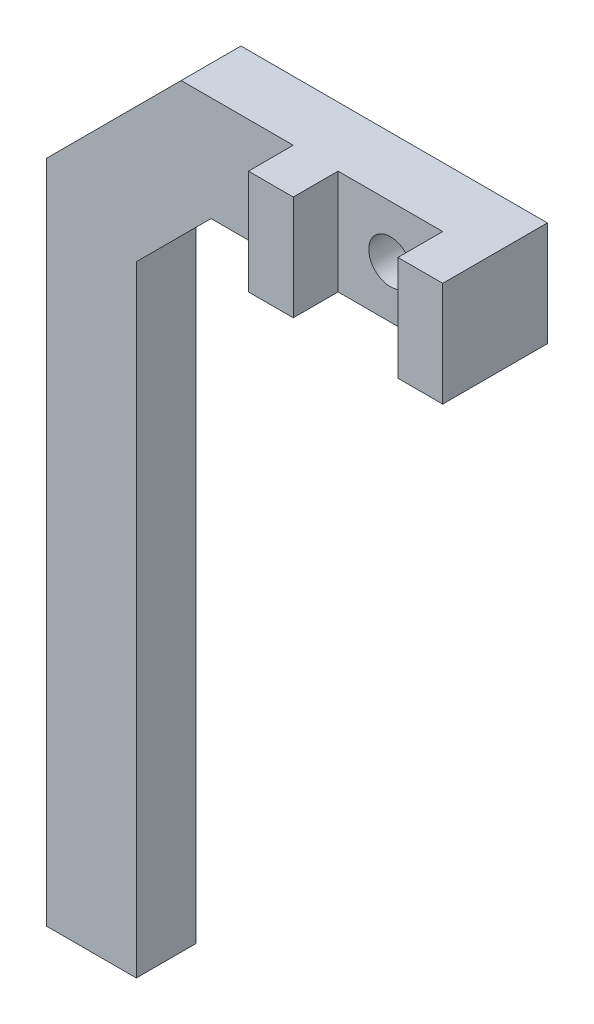
ISO-10303-21;
HEADER;
FILE_DESCRIPTION(('STEP AP214'),'2;1');
FILE_NAME('part.step','',(''),(''),'','','');
FILE_SCHEMA(('AUTOMOTIVE_DESIGN { 1 0 10303 214 1 1 1 1 }'));
ENDSEC;
DATA;
#1=APPLICATION_CONTEXT('core data for automotive mechanical design processes');
#2=APPLICATION_PROTOCOL_DEFINITION('international standard','automotive_design',2000,#1);
#3=PRODUCT_CONTEXT('',#1,'mechanical');
#4=PRODUCT('Part','Part','',(#3));
#5=PRODUCT_RELATED_PRODUCT_CATEGORY('part','',(#4));
#6=PRODUCT_DEFINITION_FORMATION('','',#4);
#7=PRODUCT_DEFINITION_CONTEXT('part definition',#1,'design');
#8=PRODUCT_DEFINITION('design','',#6,#7);
#9=PRODUCT_DEFINITION_SHAPE('','',#8);
#10=(LENGTH_UNIT() NAMED_UNIT(*) SI_UNIT(.MILLI.,.METRE.));
#11=(NAMED_UNIT(*) PLANE_ANGLE_UNIT() SI_UNIT($,.RADIAN.));
#12=(NAMED_UNIT(*) SI_UNIT($,.STERADIAN.) SOLID_ANGLE_UNIT());
#13=UNCERTAINTY_MEASURE_WITH_UNIT(LENGTH_MEASURE(1.E-05),#10,'distance_accuracy_value','');
#14=(GEOMETRIC_REPRESENTATION_CONTEXT(3) GLOBAL_UNCERTAINTY_ASSIGNED_CONTEXT((#13)) GLOBAL_UNIT_ASSIGNED_CONTEXT((#10,
#11,#12)) REPRESENTATION_CONTEXT('',''));
#15=CARTESIAN_POINT('',(0.,0.,0.));
#16=DIRECTION('',(0.,0.,1.));
#17=DIRECTION('',(1.,0.,0.));
#18=AXIS2_PLACEMENT_3D('',#15,#16,#17);
#19=CARTESIAN_POINT('',(-12.,5.5,4.4));
#20=CARTESIAN_POINT('',(-12.,5.5,2.8));
#21=CARTESIAN_POINT('',(-12.,5.5,1.2));
#22=CARTESIAN_POINT('',(-12.,5.5,-0.399999999999999));
#23=CARTESIAN_POINT('',(-17.,5.5,4.4));
#24=CARTESIAN_POINT('',(-17.,5.5,2.8));
#25=CARTESIAN_POINT('',(-17.,5.5,1.2));
#26=CARTESIAN_POINT('',(-17.,5.5,-0.399999999999999));
#27=CARTESIAN_POINT('',(-17.,0.499999999999997,4.4));
#28=CARTESIAN_POINT('',(-17.,0.499999999999997,2.8));
#29=CARTESIAN_POINT('',(-17.,0.499999999999997,1.2));
#30=CARTESIAN_POINT('',(-17.,0.499999999999997,-0.399999999999999));
#31=(BOUNDED_SURFACE() B_SPLINE_SURFACE(2,3,((#19,#20,#21,#22),(#23,#24,#25,#26),(#27,#28,#29,
#30)),.UNSPECIFIED.,.F.,.F.,.F.) B_SPLINE_SURFACE_WITH_KNOTS((3,3),(4,4),(0.,1.),(-0.0004,
0.0044),.UNSPECIFIED.) GEOMETRIC_REPRESENTATION_ITEM() RATIONAL_B_SPLINE_SURFACE(((1.,1.,1.,1.),
(0.000353553390593274,0.000353553390593274,0.000353553390593274,0.000353553390593274),(1.,1.,1.,1.))) REPRESENTATION_ITEM('') SURFACE());
#32=CARTESIAN_POINT('',(-12.,5.5,-0.399999999999999));
#33=CARTESIAN_POINT('',(-12.,5.5,1.2));
#34=CARTESIAN_POINT('',(-12.,5.5,2.8));
#35=CARTESIAN_POINT('',(-12.,5.5,4.4));
#36=(BOUNDED_CURVE() B_SPLINE_CURVE(3,(#32,#33,#34,#35),.UNSPECIFIED.,.F.,
.F.) B_SPLINE_CURVE_WITH_KNOTS((4,4),(-0.0004,0.0044),
.UNSPECIFIED.) CURVE() GEOMETRIC_REPRESENTATION_ITEM() RATIONAL_B_SPLINE_CURVE((1.,1.,1.,1.)) REPRESENTATION_ITEM(''));
#37=CARTESIAN_POINT('',(-12.,5.5,4.));
#38=VERTEX_POINT('',#37);
#39=CARTESIAN_POINT('',(-12.,5.5,0.));
#40=VERTEX_POINT('',#39);
#41=EDGE_CURVE('E237',#38,#40,#36,.F.);
#42=CARTESIAN_POINT('',(-12.,5.5,4.));
#43=CARTESIAN_POINT('',(-17.,5.5,4.));
#44=CARTESIAN_POINT('',(-17.,0.499999999999997,4.));
#45=(BOUNDED_CURVE() B_SPLINE_CURVE(2,(#42,#43,#44),.UNSPECIFIED.,.F.,
.F.) B_SPLINE_CURVE_WITH_KNOTS((3,3),(0.,1.),
.UNSPECIFIED.) CURVE() GEOMETRIC_REPRESENTATION_ITEM() RATIONAL_B_SPLINE_CURVE((1.,
0.000353553390593274,1.)) REPRESENTATION_ITEM(''));
#46=CARTESIAN_POINT('',(-17.,0.499999999999997,4.));
#47=VERTEX_POINT('',#46);
#48=EDGE_CURVE('E466',#38,#47,#45,.T.);
#49=CARTESIAN_POINT('',(-17.,0.499999999999997,4.4));
#50=CARTESIAN_POINT('',(-17.,0.499999999999997,2.8));
#51=CARTESIAN_POINT('',(-17.,0.499999999999997,1.2));
#52=CARTESIAN_POINT('',(-17.,0.499999999999997,-0.399999999999999));
#53=(BOUNDED_CURVE() B_SPLINE_CURVE(3,(#49,#50,#51,#52),.UNSPECIFIED.,.F.,
.F.) B_SPLINE_CURVE_WITH_KNOTS((4,4),(-0.0004,0.0044),
.UNSPECIFIED.) CURVE() GEOMETRIC_REPRESENTATION_ITEM() RATIONAL_B_SPLINE_CURVE((1.,1.,1.,1.)) REPRESENTATION_ITEM(''));
#54=CARTESIAN_POINT('',(-17.,0.499999999999997,0.));
#55=VERTEX_POINT('',#54);
#56=EDGE_CURVE('E424',#55,#47,#53,.F.);
#57=CARTESIAN_POINT('',(-17.,0.499999999999997,0.));
#58=CARTESIAN_POINT('',(-17.,5.5,0.));
#59=CARTESIAN_POINT('',(-12.,5.5,0.));
#60=(BOUNDED_CURVE() B_SPLINE_CURVE(2,(#57,#58,#59),.UNSPECIFIED.,.F.,
.F.) B_SPLINE_CURVE_WITH_KNOTS((3,3),(0.,1.),
.UNSPECIFIED.) CURVE() GEOMETRIC_REPRESENTATION_ITEM() RATIONAL_B_SPLINE_CURVE((1.,
0.000353553390593274,1.)) REPRESENTATION_ITEM(''));
#61=EDGE_CURVE('E330',#55,#40,#60,.T.);
#62=ORIENTED_EDGE('',*,*,#41,.F.);
#63=ORIENTED_EDGE('',*,*,#48,.T.);
#64=ORIENTED_EDGE('',*,*,#56,.F.);
#65=ORIENTED_EDGE('',*,*,#61,.T.);
#66=EDGE_LOOP('',(#62,#63,#64,#65));
#67=FACE_BOUND('',#66,.T.);
#68=ADVANCED_FACE('F41',(#67),#31,.T.);
#69=CARTESIAN_POINT('',(0.,0.,4.));
#70=DIRECTION('',(0.,0.,-1.));
#71=DIRECTION('',(-1.,0.,0.));
#72=AXIS2_PLACEMENT_3D('',#69,#70,#71);
#73=PLANE('',#72);
#74=DIRECTION('',(0.,-1.,0.));
#75=VECTOR('',#74,1.);
#76=CARTESIAN_POINT('',(-23.,0.,4.));
#77=LINE('',#76,#75);
#78=CARTESIAN_POINT('',(-23.,3.5,4.));
#79=VERTEX_POINT('',#78);
#80=CARTESIAN_POINT('',(-23.,-41.,4.));
#81=VERTEX_POINT('',#80);
#82=EDGE_CURVE('E382',#79,#81,#77,.T.);
#83=ORIENTED_EDGE('',*,*,#82,.T.);
#84=DIRECTION('',(1.,0.,0.));
#85=VECTOR('',#84,1.);
#86=CARTESIAN_POINT('',(-17.,-41.,4.));
#87=LINE('',#86,#85);
#88=CARTESIAN_POINT('',(-17.,-41.,4.));
#89=VERTEX_POINT('',#88);
#90=EDGE_CURVE('E65',#81,#89,#87,.T.);
#91=ORIENTED_EDGE('',*,*,#90,.T.);
#92=DIRECTION('',(0.,-1.,0.));
#93=VECTOR('',#92,1.);
#94=CARTESIAN_POINT('',(-17.,0.,4.));
#95=LINE('',#94,#93);
#96=EDGE_CURVE('E177',#47,#89,#95,.T.);
#97=ORIENTED_EDGE('',*,*,#96,.F.);
#98=ORIENTED_EDGE('',*,*,#48,.F.);
#99=DIRECTION('',(1.,0.,0.));
#100=VECTOR('',#99,1.);
#101=CARTESIAN_POINT('',(3.5,5.5,4.));
#102=LINE('',#101,#100);
#103=CARTESIAN_POINT('',(-6.5,5.5,4.));
#104=VERTEX_POINT('',#103);
#105=EDGE_CURVE('E233',#38,#104,#102,.T.);
#106=ORIENTED_EDGE('',*,*,#105,.T.);
#107=DIRECTION('',(0.,-1.,0.));
#108=VECTOR('',#107,1.);
#109=CARTESIAN_POINT('',(-6.5,0.,4.));
#110=LINE('',#109,#108);
#111=CARTESIAN_POINT('',(-6.5,12.5,4.));
#112=VERTEX_POINT('',#111);
#113=EDGE_CURVE('E187',#112,#104,#110,.T.);
#114=ORIENTED_EDGE('',*,*,#113,.F.);
#115=DIRECTION('',(-1.,0.,0.));
#116=VECTOR('',#115,1.);
#117=CARTESIAN_POINT('',(3.5,12.5,4.));
#118=LINE('',#117,#116);
#119=CARTESIAN_POINT('',(-14.,12.5,4.));
#120=VERTEX_POINT('',#119);
#121=EDGE_CURVE('E183',#112,#120,#118,.T.);
#122=ORIENTED_EDGE('',*,*,#121,.T.);
#123=DIRECTION('',(0.707106781186549,0.707106781186546,0.));
#124=VECTOR('',#123,1.);
#125=CARTESIAN_POINT('',(-23.,3.5,4.));
#126=LINE('',#125,#124);
#127=EDGE_CURVE('E347',#120,#79,#126,.F.);
#128=ORIENTED_EDGE('',*,*,#127,.T.);
#129=EDGE_LOOP('',(#83,#91,#97,#98,#106,#114,#122,#128));
#130=FACE_BOUND('',#129,.T.);
#131=ADVANCED_FACE('F276',(#130),#73,.F.);
#132=CARTESIAN_POINT('',(0.,9.,4.));
#133=DIRECTION('',(0.,0.,1.));
#134=DIRECTION('',(1.,0.,0.));
#135=AXIS2_PLACEMENT_3D('',#132,#133,#134);
#136=CIRCLE('',#135,1.45);
#137=CARTESIAN_POINT('',(1.45,9.,4.));
#138=VERTEX_POINT('',#137);
#139=EDGE_CURVE('E218',#138,#138,#136,.T.);
#140=ORIENTED_EDGE('',*,*,#139,.F.);
#141=EDGE_LOOP('',(#140));
#142=FACE_BOUND('',#141,.T.);
#143=DIRECTION('',(0.,1.,0.));
#144=VECTOR('',#143,1.);
#145=CARTESIAN_POINT('',(-3.5,0.,4.));
#146=LINE('',#145,#144);
#147=CARTESIAN_POINT('',(-3.5,5.5,4.));
#148=VERTEX_POINT('',#147);
#149=CARTESIAN_POINT('',(-3.5,12.5,4.));
#150=VERTEX_POINT('',#149);
#151=EDGE_CURVE('E184',#148,#150,#146,.T.);
#152=ORIENTED_EDGE('',*,*,#151,.F.);
#153=CARTESIAN_POINT('',(3.5,5.5,4.));
#154=VERTEX_POINT('',#153);
#155=EDGE_CURVE('E230',#148,#154,#102,.T.);
#156=ORIENTED_EDGE('',*,*,#155,.T.);
#157=DIRECTION('',(0.,1.,0.));
#158=VECTOR('',#157,1.);
#159=CARTESIAN_POINT('',(3.5,12.5,4.));
#160=LINE('',#159,#158);
#161=CARTESIAN_POINT('',(3.5,12.5,4.));
#162=VERTEX_POINT('',#161);
#163=EDGE_CURVE('E224',#154,#162,#160,.T.);
#164=ORIENTED_EDGE('',*,*,#163,.T.);
#165=EDGE_CURVE('E228',#162,#150,#118,.T.);
#166=ORIENTED_EDGE('',*,*,#165,.T.);
#167=EDGE_LOOP('',(#152,#156,#164,#166));
#168=FACE_BOUND('',#167,.T.);
#169=ADVANCED_FACE('F399',(#142,#168),#73,.F.);
#170=CARTESIAN_POINT('',(0.,0.,0.));
#171=DIRECTION('',(0.,0.,-1.));
#172=DIRECTION('',(-1.,0.,0.));
#173=AXIS2_PLACEMENT_3D('',#170,#171,#172);
#174=PLANE('',#173);
#175=DIRECTION('',(0.,-1.,0.));
#176=VECTOR('',#175,1.);
#177=CARTESIAN_POINT('',(-17.,0.,0.));
#178=LINE('',#177,#176);
#179=CARTESIAN_POINT('',(-17.,-41.,0.));
#180=VERTEX_POINT('',#179);
#181=EDGE_CURVE('E250',#55,#180,#178,.T.);
#182=ORIENTED_EDGE('',*,*,#181,.T.);
#183=DIRECTION('',(-1.,0.,0.));
#184=VECTOR('',#183,1.);
#185=CARTESIAN_POINT('',(0.,-41.,0.));
#186=LINE('',#185,#184);
#187=CARTESIAN_POINT('',(-23.,-41.,0.));
#188=VERTEX_POINT('',#187);
#189=EDGE_CURVE('E12',#180,#188,#186,.T.);
#190=ORIENTED_EDGE('',*,*,#189,.T.);
#191=DIRECTION('',(0.,-1.,0.));
#192=VECTOR('',#191,1.);
#193=CARTESIAN_POINT('',(-23.,0.,0.));
#194=LINE('',#193,#192);
#195=CARTESIAN_POINT('',(-23.,3.5,0.));
#196=VERTEX_POINT('',#195);
#197=EDGE_CURVE('E373',#196,#188,#194,.T.);
#198=ORIENTED_EDGE('',*,*,#197,.F.);
#199=DIRECTION('',(-0.707106781186549,-0.707106781186546,0.));
#200=VECTOR('',#199,1.);
#201=CARTESIAN_POINT('',(-13.25,13.25,0.));
#202=LINE('',#201,#200);
#203=CARTESIAN_POINT('',(-14.,12.5,0.));
#204=VERTEX_POINT('',#203);
#205=EDGE_CURVE('E343',#196,#204,#202,.F.);
#206=ORIENTED_EDGE('',*,*,#205,.T.);
#207=DIRECTION('',(-1.,0.,0.));
#208=VECTOR('',#207,1.);
#209=CARTESIAN_POINT('',(3.5,12.5,0.));
#210=LINE('',#209,#208);
#211=CARTESIAN_POINT('',(6.5,12.5,0.));
#212=VERTEX_POINT('',#211);
#213=EDGE_CURVE('E221',#212,#204,#210,.T.);
#214=ORIENTED_EDGE('',*,*,#213,.F.);
#215=DIRECTION('',(0.,1.,0.));
#216=VECTOR('',#215,1.);
#217=CARTESIAN_POINT('',(6.5,12.5,0.));
#218=LINE('',#217,#216);
#219=CARTESIAN_POINT('',(6.5,5.5,0.));
#220=VERTEX_POINT('',#219);
#221=EDGE_CURVE('E194',#220,#212,#218,.T.);
#222=ORIENTED_EDGE('',*,*,#221,.F.);
#223=DIRECTION('',(1.,0.,0.));
#224=VECTOR('',#223,1.);
#225=CARTESIAN_POINT('',(3.5,5.5,0.));
#226=LINE('',#225,#224);
#227=EDGE_CURVE('E227',#40,#220,#226,.T.);
#228=ORIENTED_EDGE('',*,*,#227,.F.);
#229=ORIENTED_EDGE('',*,*,#61,.F.);
#230=EDGE_LOOP('',(#182,#190,#198,#206,#214,#222,#228,#229));
#231=FACE_BOUND('',#230,.T.);
#232=CARTESIAN_POINT('',(0.,9.,0.));
#233=DIRECTION('',(0.,0.,1.));
#234=DIRECTION('',(1.,0.,0.));
#235=AXIS2_PLACEMENT_3D('',#232,#233,#234);
#236=CIRCLE('',#235,1.45);
#237=CARTESIAN_POINT('',(1.45,9.,0.));
#238=VERTEX_POINT('',#237);
#239=EDGE_CURVE('E217',#238,#238,#236,.T.);
#240=ORIENTED_EDGE('',*,*,#239,.T.);
#241=EDGE_LOOP('',(#240));
#242=FACE_BOUND('',#241,.T.);
#243=ADVANCED_FACE('F264',(#231,#242),#174,.T.);
#244=CARTESIAN_POINT('',(3.5,12.5,4.));
#245=DIRECTION('',(0.,-1.,0.));
#246=DIRECTION('',(1.,0.,0.));
#247=AXIS2_PLACEMENT_3D('',#244,#245,#246);
#248=PLANE('',#247);
#249=ORIENTED_EDGE('',*,*,#213,.T.);
#250=DIRECTION('',(0.,0.,1.));
#251=VECTOR('',#250,1.);
#252=CARTESIAN_POINT('',(-14.,12.5,4.));
#253=LINE('',#252,#251);
#254=EDGE_CURVE('E345',#204,#120,#253,.T.);
#255=ORIENTED_EDGE('',*,*,#254,.T.);
#256=ORIENTED_EDGE('',*,*,#121,.F.);
#257=DIRECTION('',(0.,0.,-1.));
#258=VECTOR('',#257,1.);
#259=CARTESIAN_POINT('',(-6.5,12.5,7.));
#260=LINE('',#259,#258);
#261=CARTESIAN_POINT('',(-6.5,12.5,7.));
#262=VERTEX_POINT('',#261);
#263=EDGE_CURVE('E162',#262,#112,#260,.T.);
#264=ORIENTED_EDGE('',*,*,#263,.F.);
#265=DIRECTION('',(-1.,0.,0.));
#266=VECTOR('',#265,1.);
#267=CARTESIAN_POINT('',(-3.5,12.5,7.));
#268=LINE('',#267,#266);
#269=CARTESIAN_POINT('',(-3.5,12.5,7.));
#270=VERTEX_POINT('',#269);
#271=EDGE_CURVE('E168',#270,#262,#268,.T.);
#272=ORIENTED_EDGE('',*,*,#271,.F.);
#273=DIRECTION('',(0.,0.,-1.));
#274=VECTOR('',#273,1.);
#275=CARTESIAN_POINT('',(-3.5,12.5,7.));
#276=LINE('',#275,#274);
#277=EDGE_CURVE('E390',#270,#150,#276,.T.);
#278=ORIENTED_EDGE('',*,*,#277,.T.);
#279=ORIENTED_EDGE('',*,*,#165,.F.);
#280=DIRECTION('',(0.,0.,-1.));
#281=VECTOR('',#280,1.);
#282=CARTESIAN_POINT('',(3.5,12.5,7.));
#283=LINE('',#282,#281);
#284=CARTESIAN_POINT('',(3.5,12.5,7.));
#285=VERTEX_POINT('',#284);
#286=EDGE_CURVE('E204',#285,#162,#283,.T.);
#287=ORIENTED_EDGE('',*,*,#286,.F.);
#288=DIRECTION('',(-1.,0.,0.));
#289=VECTOR('',#288,1.);
#290=CARTESIAN_POINT('',(3.5,12.5,7.));
#291=LINE('',#290,#289);
#292=CARTESIAN_POINT('',(6.5,12.5,7.));
#293=VERTEX_POINT('',#292);
#294=EDGE_CURVE('E202',#293,#285,#291,.T.);
#295=ORIENTED_EDGE('',*,*,#294,.F.);
#296=DIRECTION('',(0.,0.,-1.));
#297=VECTOR('',#296,1.);
#298=CARTESIAN_POINT('',(6.5,12.5,7.));
#299=LINE('',#298,#297);
#300=EDGE_CURVE('E208',#293,#212,#299,.T.);
#301=ORIENTED_EDGE('',*,*,#300,.T.);
#302=EDGE_LOOP('',(#249,#255,#256,#264,#272,#278,#279,#287,#295,#301));
#303=FACE_BOUND('',#302,.T.);
#304=ADVANCED_FACE('F181',(#303),#248,.F.);
#305=CARTESIAN_POINT('',(3.5,5.5,4.));
#306=DIRECTION('',(0.,1.,0.));
#307=DIRECTION('',(-1.,0.,0.));
#308=AXIS2_PLACEMENT_3D('',#305,#306,#307);
#309=PLANE('',#308);
#310=ORIENTED_EDGE('',*,*,#105,.F.);
#311=ORIENTED_EDGE('',*,*,#41,.T.);
#312=ORIENTED_EDGE('',*,*,#227,.T.);
#313=DIRECTION('',(0.,0.,-1.));
#314=VECTOR('',#313,1.);
#315=CARTESIAN_POINT('',(6.5,5.5,7.));
#316=LINE('',#315,#314);
#317=CARTESIAN_POINT('',(6.5,5.5,7.));
#318=VERTEX_POINT('',#317);
#319=EDGE_CURVE('E211',#318,#220,#316,.T.);
#320=ORIENTED_EDGE('',*,*,#319,.F.);
#321=DIRECTION('',(1.,0.,0.));
#322=VECTOR('',#321,1.);
#323=CARTESIAN_POINT('',(3.5,5.5,7.));
#324=LINE('',#323,#322);
#325=CARTESIAN_POINT('',(3.5,5.5,7.));
#326=VERTEX_POINT('',#325);
#327=EDGE_CURVE('E198',#326,#318,#324,.T.);
#328=ORIENTED_EDGE('',*,*,#327,.F.);
#329=DIRECTION('',(0.,0.,-1.));
#330=VECTOR('',#329,1.);
#331=CARTESIAN_POINT('',(3.5,5.5,7.));
#332=LINE('',#331,#330);
#333=EDGE_CURVE('E214',#326,#154,#332,.T.);
#334=ORIENTED_EDGE('',*,*,#333,.T.);
#335=ORIENTED_EDGE('',*,*,#155,.F.);
#336=DIRECTION('',(0.,0.,-1.));
#337=VECTOR('',#336,1.);
#338=CARTESIAN_POINT('',(-3.5,5.5,7.));
#339=LINE('',#338,#337);
#340=CARTESIAN_POINT('',(-3.5,5.5,7.));
#341=VERTEX_POINT('',#340);
#342=EDGE_CURVE('E189',#341,#148,#339,.T.);
#343=ORIENTED_EDGE('',*,*,#342,.F.);
#344=DIRECTION('',(1.,0.,0.));
#345=VECTOR('',#344,1.);
#346=CARTESIAN_POINT('',(-3.5,5.5,7.));
#347=LINE('',#346,#345);
#348=CARTESIAN_POINT('',(-6.5,5.49999999999999,7.));
#349=VERTEX_POINT('',#348);
#350=EDGE_CURVE('E167',#349,#341,#347,.T.);
#351=ORIENTED_EDGE('',*,*,#350,.F.);
#352=DIRECTION('',(0.,0.,-1.));
#353=VECTOR('',#352,1.);
#354=CARTESIAN_POINT('',(-6.5,5.49999999999999,7.));
#355=LINE('',#354,#353);
#356=EDGE_CURVE('E164',#349,#104,#355,.T.);
#357=ORIENTED_EDGE('',*,*,#356,.T.);
#358=EDGE_LOOP('',(#310,#311,#312,#320,#328,#334,#335,#343,#351,#357));
#359=FACE_BOUND('',#358,.T.);
#360=ADVANCED_FACE('F253',(#359),#309,.F.);
#361=CARTESIAN_POINT('',(0.,9.,4.));
#362=DIRECTION('',(0.,0.,-1.));
#363=DIRECTION('',(-1.,0.,0.));
#364=AXIS2_PLACEMENT_3D('',#361,#362,#363);
#365=CYLINDRICAL_SURFACE('',#364,1.45);
#366=ORIENTED_EDGE('',*,*,#139,.T.);
#367=EDGE_LOOP('',(#366));
#368=FACE_BOUND('',#367,.T.);
#369=ORIENTED_EDGE('',*,*,#239,.F.);
#370=EDGE_LOOP('',(#369));
#371=FACE_BOUND('',#370,.T.);
#372=ADVANCED_FACE('F263',(#368,#371),#365,.F.);
#373=CARTESIAN_POINT('',(3.5,12.5,7.));
#374=DIRECTION('',(1.,0.,0.));
#375=DIRECTION('',(0.,1.,0.));
#376=AXIS2_PLACEMENT_3D('',#373,#374,#375);
#377=PLANE('',#376);
#378=ORIENTED_EDGE('',*,*,#163,.F.);
#379=ORIENTED_EDGE('',*,*,#333,.F.);
#380=DIRECTION('',(0.,-1.,0.));
#381=VECTOR('',#380,1.);
#382=CARTESIAN_POINT('',(3.5,12.5,7.));
#383=LINE('',#382,#381);
#384=EDGE_CURVE('E195',#285,#326,#383,.T.);
#385=ORIENTED_EDGE('',*,*,#384,.F.);
#386=ORIENTED_EDGE('',*,*,#286,.T.);
#387=EDGE_LOOP('',(#378,#379,#385,#386));
#388=FACE_BOUND('',#387,.T.);
#389=ADVANCED_FACE('F401',(#388),#377,.F.);
#390=CARTESIAN_POINT('',(6.5,12.5,7.));
#391=DIRECTION('',(-1.,0.,0.));
#392=DIRECTION('',(0.,-1.,0.));
#393=AXIS2_PLACEMENT_3D('',#390,#391,#392);
#394=PLANE('',#393);
#395=ORIENTED_EDGE('',*,*,#221,.T.);
#396=ORIENTED_EDGE('',*,*,#300,.F.);
#397=DIRECTION('',(0.,1.,0.));
#398=VECTOR('',#397,1.);
#399=CARTESIAN_POINT('',(6.5,12.5,7.));
#400=LINE('',#399,#398);
#401=EDGE_CURVE('E200',#318,#293,#400,.T.);
#402=ORIENTED_EDGE('',*,*,#401,.F.);
#403=ORIENTED_EDGE('',*,*,#319,.T.);
#404=EDGE_LOOP('',(#395,#396,#402,#403));
#405=FACE_BOUND('',#404,.T.);
#406=ADVANCED_FACE('F412',(#405),#394,.F.);
#407=CARTESIAN_POINT('',(0.,0.,7.));
#408=DIRECTION('',(0.,0.,1.));
#409=DIRECTION('',(1.,0.,0.));
#410=AXIS2_PLACEMENT_3D('',#407,#408,#409);
#411=PLANE('',#410);
#412=ORIENTED_EDGE('',*,*,#384,.T.);
#413=ORIENTED_EDGE('',*,*,#327,.T.);
#414=ORIENTED_EDGE('',*,*,#401,.T.);
#415=ORIENTED_EDGE('',*,*,#294,.T.);
#416=EDGE_LOOP('',(#412,#413,#414,#415));
#417=FACE_BOUND('',#416,.T.);
#418=ADVANCED_FACE('F408',(#417),#411,.T.);
#419=CARTESIAN_POINT('',(-6.5,12.5,7.));
#420=DIRECTION('',(1.,0.,0.));
#421=DIRECTION('',(0.,1.,0.));
#422=AXIS2_PLACEMENT_3D('',#419,#420,#421);
#423=PLANE('',#422);
#424=ORIENTED_EDGE('',*,*,#263,.T.);
#425=ORIENTED_EDGE('',*,*,#113,.T.);
#426=ORIENTED_EDGE('',*,*,#356,.F.);
#427=DIRECTION('',(0.,-1.,0.));
#428=VECTOR('',#427,1.);
#429=CARTESIAN_POINT('',(-6.5,12.5,7.));
#430=LINE('',#429,#428);
#431=EDGE_CURVE('E157',#262,#349,#430,.T.);
#432=ORIENTED_EDGE('',*,*,#431,.F.);
#433=EDGE_LOOP('',(#424,#425,#426,#432));
#434=FACE_BOUND('',#433,.T.);
#435=ADVANCED_FACE('F159',(#434),#423,.F.);
#436=CARTESIAN_POINT('',(-3.5,12.5,7.));
#437=DIRECTION('',(-1.,0.,0.));
#438=DIRECTION('',(0.,-1.,0.));
#439=AXIS2_PLACEMENT_3D('',#436,#437,#438);
#440=PLANE('',#439);
#441=ORIENTED_EDGE('',*,*,#342,.T.);
#442=ORIENTED_EDGE('',*,*,#151,.T.);
#443=ORIENTED_EDGE('',*,*,#277,.F.);
#444=DIRECTION('',(0.,1.,0.));
#445=VECTOR('',#444,1.);
#446=CARTESIAN_POINT('',(-3.5,12.5,7.));
#447=LINE('',#446,#445);
#448=EDGE_CURVE('E173',#341,#270,#447,.T.);
#449=ORIENTED_EDGE('',*,*,#448,.F.);
#450=EDGE_LOOP('',(#441,#442,#443,#449));
#451=FACE_BOUND('',#450,.T.);
#452=ADVANCED_FACE('F394',(#451),#440,.F.);
#453=CARTESIAN_POINT('',(0.,0.,7.));
#454=DIRECTION('',(0.,0.,1.));
#455=DIRECTION('',(1.,0.,0.));
#456=AXIS2_PLACEMENT_3D('',#453,#454,#455);
#457=PLANE('',#456);
#458=ORIENTED_EDGE('',*,*,#271,.T.);
#459=ORIENTED_EDGE('',*,*,#431,.T.);
#460=ORIENTED_EDGE('',*,*,#350,.T.);
#461=ORIENTED_EDGE('',*,*,#448,.T.);
#462=EDGE_LOOP('',(#458,#459,#460,#461));
#463=FACE_BOUND('',#462,.T.);
#464=ADVANCED_FACE('F171',(#463),#457,.T.);
#465=CARTESIAN_POINT('',(-23.,0.,4.));
#466=DIRECTION('',(1.,0.,0.));
#467=DIRECTION('',(0.,1.,0.));
#468=AXIS2_PLACEMENT_3D('',#465,#466,#467);
#469=PLANE('',#468);
#470=ORIENTED_EDGE('',*,*,#197,.T.);
#471=DIRECTION('',(0.,0.,1.));
#472=VECTOR('',#471,1.);
#473=CARTESIAN_POINT('',(-23.,-41.,4.));
#474=LINE('',#473,#472);
#475=EDGE_CURVE('E358',#188,#81,#474,.T.);
#476=ORIENTED_EDGE('',*,*,#475,.T.);
#477=ORIENTED_EDGE('',*,*,#82,.F.);
#478=DIRECTION('',(0.,0.,-1.));
#479=VECTOR('',#478,1.);
#480=CARTESIAN_POINT('',(-23.,3.5,4.));
#481=LINE('',#480,#479);
#482=EDGE_CURVE('E335',#79,#196,#481,.T.);
#483=ORIENTED_EDGE('',*,*,#482,.T.);
#484=EDGE_LOOP('',(#470,#476,#477,#483));
#485=FACE_BOUND('',#484,.T.);
#486=ADVANCED_FACE('F420',(#485),#469,.F.);
#487=CARTESIAN_POINT('',(0.,-42.,4.));
#488=DIRECTION('',(0.,-1.,0.));
#489=DIRECTION('',(0.,0.,-1.));
#490=AXIS2_PLACEMENT_3D('',#487,#488,#489);
#491=PLANE('',#490);
#492=DIRECTION('',(-1.,0.,0.));
#493=VECTOR('',#492,1.);
#494=CARTESIAN_POINT('',(-23.,-42.,2.99999999999999));
#495=LINE('',#494,#493);
#496=CARTESIAN_POINT('',(-18.,-42.,2.99999999999999));
#497=VERTEX_POINT('',#496);
#498=CARTESIAN_POINT('',(-22.,-42.,2.99999999999999));
#499=VERTEX_POINT('',#498);
#500=EDGE_CURVE('E353',#497,#499,#495,.T.);
#501=ORIENTED_EDGE('',*,*,#500,.T.);
#502=DIRECTION('',(0.,0.,-1.));
#503=VECTOR('',#502,1.);
#504=CARTESIAN_POINT('',(-22.,-42.,0.));
#505=LINE('',#504,#503);
#506=CARTESIAN_POINT('',(-22.,-42.,1.00000000000001));
#507=VERTEX_POINT('',#506);
#508=EDGE_CURVE('E355',#499,#507,#505,.T.);
#509=ORIENTED_EDGE('',*,*,#508,.T.);
#510=DIRECTION('',(1.,0.,0.));
#511=VECTOR('',#510,1.);
#512=CARTESIAN_POINT('',(0.,-42.,1.00000000000001));
#513=LINE('',#512,#511);
#514=CARTESIAN_POINT('',(-18.,-42.,1.00000000000001));
#515=VERTEX_POINT('',#514);
#516=EDGE_CURVE('E349',#507,#515,#513,.T.);
#517=ORIENTED_EDGE('',*,*,#516,.T.);
#518=DIRECTION('',(0.,0.,1.));
#519=VECTOR('',#518,1.);
#520=CARTESIAN_POINT('',(-18.,-42.,4.));
#521=LINE('',#520,#519);
#522=EDGE_CURVE('E351',#515,#497,#521,.T.);
#523=ORIENTED_EDGE('',*,*,#522,.T.);
#524=EDGE_LOOP('',(#501,#509,#517,#523));
#525=FACE_BOUND('',#524,.T.);
#526=ADVANCED_FACE('F437',(#525),#491,.T.);
#527=CARTESIAN_POINT('',(-17.,0.,4.));
#528=DIRECTION('',(1.,0.,0.));
#529=DIRECTION('',(0.,1.,0.));
#530=AXIS2_PLACEMENT_3D('',#527,#528,#529);
#531=PLANE('',#530);
#532=ORIENTED_EDGE('',*,*,#96,.T.);
#533=DIRECTION('',(0.,0.,-1.));
#534=VECTOR('',#533,1.);
#535=CARTESIAN_POINT('',(-17.,-41.,4.));
#536=LINE('',#535,#534);
#537=EDGE_CURVE('E50',#89,#180,#536,.T.);
#538=ORIENTED_EDGE('',*,*,#537,.T.);
#539=ORIENTED_EDGE('',*,*,#181,.F.);
#540=ORIENTED_EDGE('',*,*,#56,.T.);
#541=EDGE_LOOP('',(#532,#538,#539,#540));
#542=FACE_BOUND('',#541,.T.);
#543=ADVANCED_FACE('F428',(#542),#531,.T.);
#544=CARTESIAN_POINT('',(-23.,3.5,4.));
#545=DIRECTION('',(0.707106781186546,-0.707106781186549,0.));
#546=DIRECTION('',(0.,0.,-1.));
#547=AXIS2_PLACEMENT_3D('',#544,#545,#546);
#548=PLANE('',#547);
#549=ORIENTED_EDGE('',*,*,#127,.F.);
#550=ORIENTED_EDGE('',*,*,#254,.F.);
#551=ORIENTED_EDGE('',*,*,#205,.F.);
#552=ORIENTED_EDGE('',*,*,#482,.F.);
#553=EDGE_LOOP('',(#549,#550,#551,#552));
#554=FACE_BOUND('',#553,.T.);
#555=ADVANCED_FACE('F278',(#554),#548,.F.);
#556=CARTESIAN_POINT('',(-17.,-41.,4.));
#557=DIRECTION('',(-0.707106781186545,0.70710678118655,0.));
#558=DIRECTION('',(0.,0.,-1.));
#559=AXIS2_PLACEMENT_3D('',#556,#557,#558);
#560=PLANE('',#559);
#561=DIRECTION('',(-0.577350269189627,-0.577350269189623,0.577350269189627));
#562=VECTOR('',#561,1.);
#563=CARTESIAN_POINT('',(-11.3333333333333,-35.3333333333333,-5.66666666666669));
#564=LINE('',#563,#562);
#565=EDGE_CURVE('E366',#180,#515,#564,.T.);
#566=ORIENTED_EDGE('',*,*,#565,.F.);
#567=ORIENTED_EDGE('',*,*,#537,.F.);
#568=DIRECTION('',(0.577350269189627,0.577350269189623,0.577350269189627));
#569=VECTOR('',#568,1.);
#570=CARTESIAN_POINT('',(-17.,-41.,4.));
#571=LINE('',#570,#569);
#572=EDGE_CURVE('E45',#497,#89,#571,.T.);
#573=ORIENTED_EDGE('',*,*,#572,.F.);
#574=ORIENTED_EDGE('',*,*,#522,.F.);
#575=EDGE_LOOP('',(#566,#567,#573,#574));
#576=FACE_BOUND('',#575,.T.);
#577=ADVANCED_FACE('F43',(#576),#560,.F.);
#578=CARTESIAN_POINT('',(0.,-42.,2.99999999999999));
#579=DIRECTION('',(0.,-0.70710678118655,0.707106781186545));
#580=DIRECTION('',(1.,0.,0.));
#581=AXIS2_PLACEMENT_3D('',#578,#579,#580);
#582=PLANE('',#581);
#583=ORIENTED_EDGE('',*,*,#572,.T.);
#584=ORIENTED_EDGE('',*,*,#90,.F.);
#585=DIRECTION('',(0.577350269189627,-0.577350269189623,-0.577350269189627));
#586=VECTOR('',#585,1.);
#587=CARTESIAN_POINT('',(-14.6666666666666,-49.3333333333333,-4.33333333333337));
#588=LINE('',#587,#586);
#589=EDGE_CURVE('E365',#499,#81,#588,.F.);
#590=ORIENTED_EDGE('',*,*,#589,.F.);
#591=ORIENTED_EDGE('',*,*,#500,.F.);
#592=EDGE_LOOP('',(#583,#584,#590,#591));
#593=FACE_BOUND('',#592,.T.);
#594=ADVANCED_FACE('F475',(#593),#582,.T.);
#595=CARTESIAN_POINT('',(0.,-41.,0.));
#596=DIRECTION('',(0.,0.70710678118655,0.707106781186545));
#597=DIRECTION('',(-1.,0.,0.));
#598=AXIS2_PLACEMENT_3D('',#595,#596,#597);
#599=PLANE('',#598);
#600=ORIENTED_EDGE('',*,*,#565,.T.);
#601=ORIENTED_EDGE('',*,*,#516,.F.);
#602=DIRECTION('',(0.577350269189627,-0.577350269189623,0.577350269189627));
#603=VECTOR('',#602,1.);
#604=CARTESIAN_POINT('',(-15.3333333333333,-48.6666666666667,7.6666666666667));
#605=LINE('',#604,#603);
#606=EDGE_CURVE('E363',#188,#507,#605,.T.);
#607=ORIENTED_EDGE('',*,*,#606,.F.);
#608=ORIENTED_EDGE('',*,*,#189,.F.);
#609=EDGE_LOOP('',(#600,#601,#607,#608));
#610=FACE_BOUND('',#609,.T.);
#611=ADVANCED_FACE('F470',(#610),#599,.F.);
#612=CARTESIAN_POINT('',(-22.,-42.,4.));
#613=DIRECTION('',(-0.707106781186545,-0.70710678118655,0.));
#614=DIRECTION('',(0.,0.,1.));
#615=AXIS2_PLACEMENT_3D('',#612,#613,#614);
#616=PLANE('',#615);
#617=ORIENTED_EDGE('',*,*,#589,.T.);
#618=ORIENTED_EDGE('',*,*,#475,.F.);
#619=ORIENTED_EDGE('',*,*,#606,.T.);
#620=ORIENTED_EDGE('',*,*,#508,.F.);
#621=EDGE_LOOP('',(#617,#618,#619,#620));
#622=FACE_BOUND('',#621,.T.);
#623=ADVANCED_FACE('F473',(#622),#616,.T.);
#624=CLOSED_SHELL('',(#68,#131,#169,#243,#304,#360,#372,#389,#406,#418,#435,#452,#464,#486,#526,
#543,#555,#577,#594,#611,#623));
#625=MANIFOLD_SOLID_BREP('B2',#624);
#626=ADVANCED_BREP_SHAPE_REPRESENTATION('',(#18,#625),#14);
#627=SHAPE_DEFINITION_REPRESENTATION(#9,#626);
ENDSEC;
END-ISO-10303-21;
